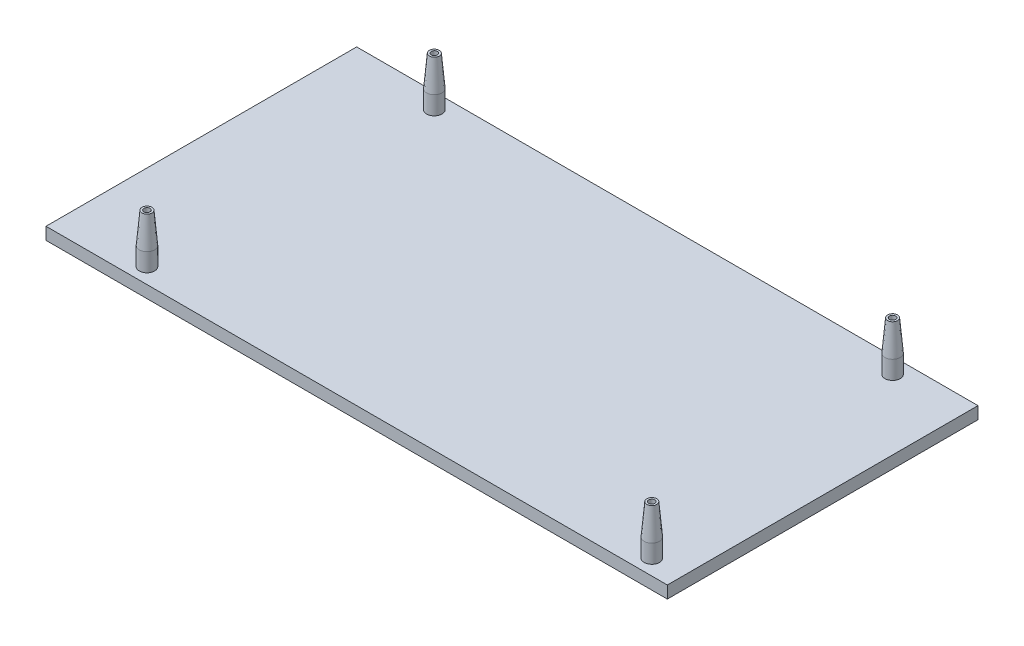
ISO-10303-21;
HEADER;
FILE_DESCRIPTION(('STEP AP214'),'2;1');
FILE_NAME('part.step','',(''),(''),'','','');
FILE_SCHEMA(('AUTOMOTIVE_DESIGN { 1 0 10303 214 1 1 1 1 }'));
ENDSEC;
DATA;
#1=APPLICATION_CONTEXT('core data for automotive mechanical design processes');
#2=APPLICATION_PROTOCOL_DEFINITION('international standard','automotive_design',2000,#1);
#3=PRODUCT_CONTEXT('',#1,'mechanical');
#4=PRODUCT('Part','Part','',(#3));
#5=PRODUCT_RELATED_PRODUCT_CATEGORY('part','',(#4));
#6=PRODUCT_DEFINITION_FORMATION('','',#4);
#7=PRODUCT_DEFINITION_CONTEXT('part definition',#1,'design');
#8=PRODUCT_DEFINITION('design','',#6,#7);
#9=PRODUCT_DEFINITION_SHAPE('','',#8);
#10=(LENGTH_UNIT() NAMED_UNIT(*) SI_UNIT(.MILLI.,.METRE.));
#11=(NAMED_UNIT(*) PLANE_ANGLE_UNIT() SI_UNIT($,.RADIAN.));
#12=(NAMED_UNIT(*) SI_UNIT($,.STERADIAN.) SOLID_ANGLE_UNIT());
#13=UNCERTAINTY_MEASURE_WITH_UNIT(LENGTH_MEASURE(1.E-05),#10,'distance_accuracy_value','');
#14=(GEOMETRIC_REPRESENTATION_CONTEXT(3) GLOBAL_UNCERTAINTY_ASSIGNED_CONTEXT((#13)) GLOBAL_UNIT_ASSIGNED_CONTEXT((#10,
#11,#12)) REPRESENTATION_CONTEXT('',''));
#15=CARTESIAN_POINT('',(0.,0.,0.));
#16=DIRECTION('',(0.,0.,1.));
#17=DIRECTION('',(1.,0.,0.));
#18=AXIS2_PLACEMENT_3D('',#15,#16,#17);
#19=CARTESIAN_POINT('',(0.,2.,0.));
#20=DIRECTION('',(0.,1.,0.));
#21=DIRECTION('',(0.,0.,1.));
#22=AXIS2_PLACEMENT_3D('',#19,#20,#21);
#23=PLANE('',#22);
#24=CARTESIAN_POINT('',(70.1588451313209,2.,24.0196720833392));
#25=DIRECTION('',(0.,1.,0.));
#26=DIRECTION('',(0.,0.,1.));
#27=AXIS2_PLACEMENT_3D('',#24,#25,#26);
#28=CIRCLE('',#27,1.25);
#29=CARTESIAN_POINT('',(70.1588451313209,2.,25.2696720833392));
#30=VERTEX_POINT('',#29);
#31=EDGE_CURVE('E199',#30,#30,#28,.T.);
#32=ORIENTED_EDGE('',*,*,#31,.F.);
#33=EDGE_LOOP('',(#32));
#34=FACE_BOUND('',#33,.T.);
#35=CARTESIAN_POINT('',(-11.1211548686791,2.,-21.7003279166608));
#36=DIRECTION('',(0.,1.,0.));
#37=DIRECTION('',(0.,0.,1.));
#38=AXIS2_PLACEMENT_3D('',#35,#36,#37);
#39=CIRCLE('',#38,1.25);
#40=CARTESIAN_POINT('',(-11.1211548686791,2.,-20.4503279166608));
#41=VERTEX_POINT('',#40);
#42=EDGE_CURVE('E211',#41,#41,#39,.T.);
#43=ORIENTED_EDGE('',*,*,#42,.F.);
#44=EDGE_LOOP('',(#43));
#45=FACE_BOUND('',#44,.T.);
#46=DIRECTION('',(0.,0.,1.));
#47=VECTOR('',#46,1.);
#48=CARTESIAN_POINT('',(-26.3611548686791,2.,-24.2403279166608));
#49=LINE('',#48,#47);
#50=CARTESIAN_POINT('',(-26.3611548686791,2.,-24.2403279166608));
#51=VERTEX_POINT('',#50);
#52=CARTESIAN_POINT('',(-26.3611548686791,2.,26.5596720833392));
#53=VERTEX_POINT('',#52);
#54=EDGE_CURVE('E86',#51,#53,#49,.T.);
#55=ORIENTED_EDGE('',*,*,#54,.T.);
#56=DIRECTION('',(1.,0.,0.));
#57=VECTOR('',#56,1.);
#58=CARTESIAN_POINT('',(-26.3611548686791,2.,26.5596720833392));
#59=LINE('',#58,#57);
#60=CARTESIAN_POINT('',(75.2388451313209,2.,26.5596720833392));
#61=VERTEX_POINT('',#60);
#62=EDGE_CURVE('E81',#53,#61,#59,.T.);
#63=ORIENTED_EDGE('',*,*,#62,.T.);
#64=DIRECTION('',(0.,0.,-1.));
#65=VECTOR('',#64,1.);
#66=CARTESIAN_POINT('',(75.2388451313209,2.,-24.2403279166608));
#67=LINE('',#66,#65);
#68=CARTESIAN_POINT('',(75.2388451313209,2.,-24.2403279166608));
#69=VERTEX_POINT('',#68);
#70=EDGE_CURVE('E84',#61,#69,#67,.T.);
#71=ORIENTED_EDGE('',*,*,#70,.T.);
#72=DIRECTION('',(-1.,0.,0.));
#73=VECTOR('',#72,1.);
#74=CARTESIAN_POINT('',(-26.3611548686791,2.,-24.2403279166608));
#75=LINE('',#74,#73);
#76=EDGE_CURVE('E50',#69,#51,#75,.T.);
#77=ORIENTED_EDGE('',*,*,#76,.T.);
#78=EDGE_LOOP('',(#55,#63,#71,#77));
#79=FACE_BOUND('',#78,.T.);
#80=CARTESIAN_POINT('',(-12.3911548686791,2.,24.0196720833392));
#81=DIRECTION('',(0.,1.,0.));
#82=DIRECTION('',(0.,0.,1.));
#83=AXIS2_PLACEMENT_3D('',#80,#81,#82);
#84=CIRCLE('',#83,1.25);
#85=CARTESIAN_POINT('',(-12.3911548686791,2.,25.2696720833392));
#86=VERTEX_POINT('',#85);
#87=EDGE_CURVE('E205',#86,#86,#84,.T.);
#88=ORIENTED_EDGE('',*,*,#87,.F.);
#89=EDGE_LOOP('',(#88));
#90=FACE_BOUND('',#89,.T.);
#91=CARTESIAN_POINT('',(63.8088451313209,2.,-21.7003279166608));
#92=DIRECTION('',(0.,1.,0.));
#93=DIRECTION('',(0.,0.,1.));
#94=AXIS2_PLACEMENT_3D('',#91,#92,#93);
#95=CIRCLE('',#94,1.25);
#96=CARTESIAN_POINT('',(63.8088451313209,2.,-20.4503279166608));
#97=VERTEX_POINT('',#96);
#98=EDGE_CURVE('E191',#97,#97,#95,.T.);
#99=ORIENTED_EDGE('',*,*,#98,.F.);
#100=EDGE_LOOP('',(#99));
#101=FACE_BOUND('',#100,.T.);
#102=ADVANCED_FACE('F33',(#34,#45,#79,#90,#101),#23,.T.);
#103=CARTESIAN_POINT('',(0.,0.,0.));
#104=DIRECTION('',(0.,1.,0.));
#105=DIRECTION('',(0.,0.,1.));
#106=AXIS2_PLACEMENT_3D('',#103,#104,#105);
#107=PLANE('',#106);
#108=DIRECTION('',(0.,0.,1.));
#109=VECTOR('',#108,1.);
#110=CARTESIAN_POINT('',(-26.3611548686791,0.,-24.2403279166608));
#111=LINE('',#110,#109);
#112=CARTESIAN_POINT('',(-26.3611548686791,0.,-24.2403279166608));
#113=VERTEX_POINT('',#112);
#114=CARTESIAN_POINT('',(-26.3611548686791,0.,26.5596720833392));
#115=VERTEX_POINT('',#114);
#116=EDGE_CURVE('E101',#113,#115,#111,.T.);
#117=ORIENTED_EDGE('',*,*,#116,.F.);
#118=DIRECTION('',(-1.,0.,0.));
#119=VECTOR('',#118,1.);
#120=CARTESIAN_POINT('',(-26.3611548686791,0.,-24.2403279166608));
#121=LINE('',#120,#119);
#122=CARTESIAN_POINT('',(75.2388451313209,0.,-24.2403279166608));
#123=VERTEX_POINT('',#122);
#124=EDGE_CURVE('E73',#123,#113,#121,.T.);
#125=ORIENTED_EDGE('',*,*,#124,.F.);
#126=DIRECTION('',(0.,0.,-1.));
#127=VECTOR('',#126,1.);
#128=CARTESIAN_POINT('',(75.2388451313209,0.,-24.2403279166608));
#129=LINE('',#128,#127);
#130=CARTESIAN_POINT('',(75.2388451313209,0.,26.5596720833392));
#131=VERTEX_POINT('',#130);
#132=EDGE_CURVE('E67',#131,#123,#129,.T.);
#133=ORIENTED_EDGE('',*,*,#132,.F.);
#134=DIRECTION('',(1.,0.,0.));
#135=VECTOR('',#134,1.);
#136=CARTESIAN_POINT('',(-26.3611548686791,0.,26.5596720833392));
#137=LINE('',#136,#135);
#138=EDGE_CURVE('E91',#115,#131,#137,.T.);
#139=ORIENTED_EDGE('',*,*,#138,.F.);
#140=EDGE_LOOP('',(#117,#125,#133,#139));
#141=FACE_BOUND('',#140,.T.);
#142=CARTESIAN_POINT('',(-11.1211548686791,0.,-21.7003279166608));
#143=DIRECTION('',(0.,1.,0.));
#144=DIRECTION('',(0.,0.,1.));
#145=AXIS2_PLACEMENT_3D('',#142,#143,#144);
#146=CIRCLE('',#145,0.500000000000001);
#147=CARTESIAN_POINT('',(-11.1211548686791,0.,-21.2003279166608));
#148=VERTEX_POINT('',#147);
#149=EDGE_CURVE('E104',#148,#148,#146,.T.);
#150=ORIENTED_EDGE('',*,*,#149,.T.);
#151=EDGE_LOOP('',(#150));
#152=FACE_BOUND('',#151,.T.);
#153=CARTESIAN_POINT('',(-12.3911548686791,0.,24.0196720833392));
#154=DIRECTION('',(0.,1.,0.));
#155=DIRECTION('',(0.,0.,1.));
#156=AXIS2_PLACEMENT_3D('',#153,#154,#155);
#157=CIRCLE('',#156,0.500000000000001);
#158=CARTESIAN_POINT('',(-12.3911548686791,0.,24.5196720833392));
#159=VERTEX_POINT('',#158);
#160=EDGE_CURVE('E220',#159,#159,#157,.T.);
#161=ORIENTED_EDGE('',*,*,#160,.T.);
#162=EDGE_LOOP('',(#161));
#163=FACE_BOUND('',#162,.T.);
#164=CARTESIAN_POINT('',(63.8088451313209,0.,-21.7003279166608));
#165=DIRECTION('',(0.,1.,0.));
#166=DIRECTION('',(0.,0.,1.));
#167=AXIS2_PLACEMENT_3D('',#164,#165,#166);
#168=CIRCLE('',#167,0.499999999999999);
#169=CARTESIAN_POINT('',(63.8088451313209,0.,-21.2003279166608));
#170=VERTEX_POINT('',#169);
#171=EDGE_CURVE('E217',#170,#170,#168,.T.);
#172=ORIENTED_EDGE('',*,*,#171,.T.);
#173=EDGE_LOOP('',(#172));
#174=FACE_BOUND('',#173,.T.);
#175=CARTESIAN_POINT('',(70.1588451313209,0.,24.0196720833392));
#176=DIRECTION('',(0.,1.,0.));
#177=DIRECTION('',(0.,0.,1.));
#178=AXIS2_PLACEMENT_3D('',#175,#176,#177);
#179=CIRCLE('',#178,0.499999999999999);
#180=CARTESIAN_POINT('',(70.1588451313209,0.,24.5196720833392));
#181=VERTEX_POINT('',#180);
#182=EDGE_CURVE('E214',#181,#181,#179,.T.);
#183=ORIENTED_EDGE('',*,*,#182,.T.);
#184=EDGE_LOOP('',(#183));
#185=FACE_BOUND('',#184,.T.);
#186=ADVANCED_FACE('F144',(#141,#152,#163,#174,#185),#107,.F.);
#187=CARTESIAN_POINT('',(-26.3611548686791,2.,-24.2403279166608));
#188=DIRECTION('',(1.,0.,0.));
#189=DIRECTION('',(0.,0.,-1.));
#190=AXIS2_PLACEMENT_3D('',#187,#188,#189);
#191=PLANE('',#190);
#192=ORIENTED_EDGE('',*,*,#116,.T.);
#193=DIRECTION('',(0.,-1.,0.));
#194=VECTOR('',#193,1.);
#195=CARTESIAN_POINT('',(-26.3611548686791,2.,26.5596720833392));
#196=LINE('',#195,#194);
#197=EDGE_CURVE('E92',#53,#115,#196,.T.);
#198=ORIENTED_EDGE('',*,*,#197,.F.);
#199=ORIENTED_EDGE('',*,*,#54,.F.);
#200=DIRECTION('',(0.,-1.,0.));
#201=VECTOR('',#200,1.);
#202=CARTESIAN_POINT('',(-26.3611548686791,2.,-24.2403279166608));
#203=LINE('',#202,#201);
#204=EDGE_CURVE('E97',#51,#113,#203,.T.);
#205=ORIENTED_EDGE('',*,*,#204,.T.);
#206=EDGE_LOOP('',(#192,#198,#199,#205));
#207=FACE_BOUND('',#206,.T.);
#208=ADVANCED_FACE('F150',(#207),#191,.F.);
#209=CARTESIAN_POINT('',(-26.3611548686791,2.,26.5596720833392));
#210=DIRECTION('',(0.,0.,-1.));
#211=DIRECTION('',(-1.,0.,0.));
#212=AXIS2_PLACEMENT_3D('',#209,#210,#211);
#213=PLANE('',#212);
#214=ORIENTED_EDGE('',*,*,#138,.T.);
#215=DIRECTION('',(0.,-1.,0.));
#216=VECTOR('',#215,1.);
#217=CARTESIAN_POINT('',(75.2388451313209,2.,26.5596720833392));
#218=LINE('',#217,#216);
#219=EDGE_CURVE('E89',#61,#131,#218,.T.);
#220=ORIENTED_EDGE('',*,*,#219,.F.);
#221=ORIENTED_EDGE('',*,*,#62,.F.);
#222=ORIENTED_EDGE('',*,*,#197,.T.);
#223=EDGE_LOOP('',(#214,#220,#221,#222));
#224=FACE_BOUND('',#223,.T.);
#225=ADVANCED_FACE('F90',(#224),#213,.F.);
#226=CARTESIAN_POINT('',(75.2388451313209,2.,-24.2403279166608));
#227=DIRECTION('',(-1.,0.,0.));
#228=DIRECTION('',(0.,0.,1.));
#229=AXIS2_PLACEMENT_3D('',#226,#227,#228);
#230=PLANE('',#229);
#231=ORIENTED_EDGE('',*,*,#132,.T.);
#232=DIRECTION('',(0.,-1.,0.));
#233=VECTOR('',#232,1.);
#234=CARTESIAN_POINT('',(75.2388451313209,2.,-24.2403279166608));
#235=LINE('',#234,#233);
#236=EDGE_CURVE('E93',#69,#123,#235,.T.);
#237=ORIENTED_EDGE('',*,*,#236,.F.);
#238=ORIENTED_EDGE('',*,*,#70,.F.);
#239=ORIENTED_EDGE('',*,*,#219,.T.);
#240=EDGE_LOOP('',(#231,#237,#238,#239));
#241=FACE_BOUND('',#240,.T.);
#242=ADVANCED_FACE('F95',(#241),#230,.F.);
#243=CARTESIAN_POINT('',(-26.3611548686791,2.,-24.2403279166608));
#244=DIRECTION('',(0.,0.,1.));
#245=DIRECTION('',(1.,0.,0.));
#246=AXIS2_PLACEMENT_3D('',#243,#244,#245);
#247=PLANE('',#246);
#248=ORIENTED_EDGE('',*,*,#124,.T.);
#249=ORIENTED_EDGE('',*,*,#204,.F.);
#250=ORIENTED_EDGE('',*,*,#76,.F.);
#251=ORIENTED_EDGE('',*,*,#236,.T.);
#252=EDGE_LOOP('',(#248,#249,#250,#251));
#253=FACE_BOUND('',#252,.T.);
#254=ADVANCED_FACE('F159',(#253),#247,.F.);
#255=CARTESIAN_POINT('',(-11.1211548686791,2.,-21.7003279166608));
#256=DIRECTION('',(0.,-1.,0.));
#257=DIRECTION('',(0.,0.,-1.));
#258=AXIS2_PLACEMENT_3D('',#255,#256,#257);
#259=CYLINDRICAL_SURFACE('',#258,0.500000000000001);
#260=ORIENTED_EDGE('',*,*,#149,.F.);
#261=EDGE_LOOP('',(#260));
#262=FACE_BOUND('',#261,.T.);
#263=CARTESIAN_POINT('',(-11.1211548686791,10.,-21.7003279166608));
#264=DIRECTION('',(0.,1.,0.));
#265=DIRECTION('',(0.,0.,1.));
#266=AXIS2_PLACEMENT_3D('',#263,#264,#265);
#267=CIRCLE('',#266,0.500000000000001);
#268=CARTESIAN_POINT('',(-11.1211548686791,10.,-21.2003279166608));
#269=VERTEX_POINT('',#268);
#270=EDGE_CURVE('E208',#269,#269,#267,.T.);
#271=ORIENTED_EDGE('',*,*,#270,.T.);
#272=EDGE_LOOP('',(#271));
#273=FACE_BOUND('',#272,.T.);
#274=ADVANCED_FACE('F156',(#262,#273),#259,.F.);
#275=CARTESIAN_POINT('',(-12.3911548686791,2.,24.0196720833392));
#276=DIRECTION('',(0.,-1.,0.));
#277=DIRECTION('',(0.,0.,-1.));
#278=AXIS2_PLACEMENT_3D('',#275,#276,#277);
#279=CYLINDRICAL_SURFACE('',#278,0.500000000000001);
#280=ORIENTED_EDGE('',*,*,#160,.F.);
#281=EDGE_LOOP('',(#280));
#282=FACE_BOUND('',#281,.T.);
#283=CARTESIAN_POINT('',(-12.3911548686791,10.,24.0196720833392));
#284=DIRECTION('',(0.,1.,0.));
#285=DIRECTION('',(0.,0.,1.));
#286=AXIS2_PLACEMENT_3D('',#283,#284,#285);
#287=CIRCLE('',#286,0.500000000000001);
#288=CARTESIAN_POINT('',(-12.3911548686791,10.,24.5196720833392));
#289=VERTEX_POINT('',#288);
#290=EDGE_CURVE('E202',#289,#289,#287,.T.);
#291=ORIENTED_EDGE('',*,*,#290,.T.);
#292=EDGE_LOOP('',(#291));
#293=FACE_BOUND('',#292,.T.);
#294=ADVANCED_FACE('F230',(#282,#293),#279,.F.);
#295=CARTESIAN_POINT('',(63.8088451313209,2.,-21.7003279166608));
#296=DIRECTION('',(0.,-1.,0.));
#297=DIRECTION('',(0.,0.,-1.));
#298=AXIS2_PLACEMENT_3D('',#295,#296,#297);
#299=CYLINDRICAL_SURFACE('',#298,0.499999999999999);
#300=ORIENTED_EDGE('',*,*,#171,.F.);
#301=EDGE_LOOP('',(#300));
#302=FACE_BOUND('',#301,.T.);
#303=CARTESIAN_POINT('',(63.8088451313209,10.,-21.7003279166608));
#304=DIRECTION('',(0.,1.,0.));
#305=DIRECTION('',(0.,0.,1.));
#306=AXIS2_PLACEMENT_3D('',#303,#304,#305);
#307=CIRCLE('',#306,0.499999999999999);
#308=CARTESIAN_POINT('',(63.8088451313209,10.,-21.2003279166608));
#309=VERTEX_POINT('',#308);
#310=EDGE_CURVE('E189',#309,#309,#307,.T.);
#311=ORIENTED_EDGE('',*,*,#310,.T.);
#312=EDGE_LOOP('',(#311));
#313=FACE_BOUND('',#312,.T.);
#314=ADVANCED_FACE('F245',(#302,#313),#299,.F.);
#315=CARTESIAN_POINT('',(70.1588451313209,2.,24.0196720833392));
#316=DIRECTION('',(0.,-1.,0.));
#317=DIRECTION('',(0.,0.,-1.));
#318=AXIS2_PLACEMENT_3D('',#315,#316,#317);
#319=CYLINDRICAL_SURFACE('',#318,0.499999999999999);
#320=ORIENTED_EDGE('',*,*,#182,.F.);
#321=EDGE_LOOP('',(#320));
#322=FACE_BOUND('',#321,.T.);
#323=CARTESIAN_POINT('',(70.1588451313209,10.,24.0196720833392));
#324=DIRECTION('',(0.,1.,0.));
#325=DIRECTION('',(0.,0.,1.));
#326=AXIS2_PLACEMENT_3D('',#323,#324,#325);
#327=CIRCLE('',#326,0.499999999999999);
#328=CARTESIAN_POINT('',(70.1588451313209,10.,24.5196720833392));
#329=VERTEX_POINT('',#328);
#330=EDGE_CURVE('E194',#329,#329,#327,.T.);
#331=ORIENTED_EDGE('',*,*,#330,.T.);
#332=EDGE_LOOP('',(#331));
#333=FACE_BOUND('',#332,.T.);
#334=ADVANCED_FACE('F236',(#322,#333),#319,.F.);
#335=CARTESIAN_POINT('',(-11.1211548686791,10.,-21.7003279166608));
#336=DIRECTION('',(0.,1.,0.));
#337=DIRECTION('',(0.,0.,1.));
#338=AXIS2_PLACEMENT_3D('',#335,#336,#337);
#339=PLANE('',#338);
#340=CARTESIAN_POINT('',(-11.1211548686791,10.,-21.7003279166608));
#341=DIRECTION('',(0.,1.,0.));
#342=DIRECTION('',(0.,0.,1.));
#343=AXIS2_PLACEMENT_3D('',#340,#341,#342);
#344=CIRCLE('',#343,0.812556682370437);
#345=CARTESIAN_POINT('',(-11.1211548686791,10.,-20.8877712342904));
#346=VERTEX_POINT('',#345);
#347=EDGE_CURVE('E111',#346,#346,#344,.T.);
#348=ORIENTED_EDGE('',*,*,#347,.T.);
#349=EDGE_LOOP('',(#348));
#350=FACE_BOUND('',#349,.T.);
#351=ORIENTED_EDGE('',*,*,#270,.F.);
#352=EDGE_LOOP('',(#351));
#353=FACE_BOUND('',#352,.T.);
#354=ADVANCED_FACE('F233',(#350,#353),#339,.T.);
#355=CARTESIAN_POINT('',(-11.1211548686791,10.,-21.7003279166608));
#356=DIRECTION('',(0.,-1.,0.));
#357=DIRECTION('',(0.,0.,-1.));
#358=AXIS2_PLACEMENT_3D('',#355,#356,#357);
#359=CYLINDRICAL_SURFACE('',#358,1.25);
#360=CARTESIAN_POINT('',(-11.1211548686791,5.00000000000053,-21.7003279166608));
#361=DIRECTION('',(0.,1.,0.));
#362=DIRECTION('',(0.,0.,1.));
#363=AXIS2_PLACEMENT_3D('',#360,#361,#362);
#364=CIRCLE('',#363,1.25);
#365=CARTESIAN_POINT('',(-11.1211548686791,5.00000000000053,-20.4503279166608));
#366=VERTEX_POINT('',#365);
#367=EDGE_CURVE('E114',#366,#366,#364,.F.);
#368=ORIENTED_EDGE('',*,*,#367,.T.);
#369=EDGE_LOOP('',(#368));
#370=FACE_BOUND('',#369,.T.);
#371=ORIENTED_EDGE('',*,*,#42,.T.);
#372=EDGE_LOOP('',(#371));
#373=FACE_BOUND('',#372,.T.);
#374=ADVANCED_FACE('F235',(#370,#373),#359,.T.);
#375=CARTESIAN_POINT('',(-12.3911548686791,10.,24.0196720833392));
#376=DIRECTION('',(0.,1.,0.));
#377=DIRECTION('',(0.,0.,1.));
#378=AXIS2_PLACEMENT_3D('',#375,#376,#377);
#379=PLANE('',#378);
#380=CARTESIAN_POINT('',(-12.3911548686791,10.,24.0196720833392));
#381=DIRECTION('',(0.,1.,0.));
#382=DIRECTION('',(0.,0.,1.));
#383=AXIS2_PLACEMENT_3D('',#380,#381,#382);
#384=CIRCLE('',#383,0.812556682370437);
#385=CARTESIAN_POINT('',(-12.3911548686791,10.,24.8322287657096));
#386=VERTEX_POINT('',#385);
#387=EDGE_CURVE('E42',#386,#386,#384,.T.);
#388=ORIENTED_EDGE('',*,*,#387,.T.);
#389=EDGE_LOOP('',(#388));
#390=FACE_BOUND('',#389,.T.);
#391=ORIENTED_EDGE('',*,*,#290,.F.);
#392=EDGE_LOOP('',(#391));
#393=FACE_BOUND('',#392,.T.);
#394=ADVANCED_FACE('F131',(#390,#393),#379,.T.);
#395=CARTESIAN_POINT('',(-12.3911548686791,10.,24.0196720833392));
#396=DIRECTION('',(0.,-1.,0.));
#397=DIRECTION('',(0.,0.,-1.));
#398=AXIS2_PLACEMENT_3D('',#395,#396,#397);
#399=CYLINDRICAL_SURFACE('',#398,1.25);
#400=CARTESIAN_POINT('',(-12.3911548686791,5.00000000000053,24.0196720833392));
#401=DIRECTION('',(0.,1.,0.));
#402=DIRECTION('',(0.,0.,1.));
#403=AXIS2_PLACEMENT_3D('',#400,#401,#402);
#404=CIRCLE('',#403,1.25);
#405=CARTESIAN_POINT('',(-12.3911548686791,5.00000000000053,25.2696720833392));
#406=VERTEX_POINT('',#405);
#407=EDGE_CURVE('E11',#406,#406,#404,.F.);
#408=ORIENTED_EDGE('',*,*,#407,.T.);
#409=EDGE_LOOP('',(#408));
#410=FACE_BOUND('',#409,.T.);
#411=ORIENTED_EDGE('',*,*,#87,.T.);
#412=EDGE_LOOP('',(#411));
#413=FACE_BOUND('',#412,.T.);
#414=ADVANCED_FACE('F249',(#410,#413),#399,.T.);
#415=CARTESIAN_POINT('',(70.1588451313209,10.,24.0196720833392));
#416=DIRECTION('',(0.,1.,0.));
#417=DIRECTION('',(0.,0.,1.));
#418=AXIS2_PLACEMENT_3D('',#415,#416,#417);
#419=PLANE('',#418);
#420=CARTESIAN_POINT('',(70.1588451313209,10.,24.0196720833392));
#421=DIRECTION('',(0.,1.,0.));
#422=DIRECTION('',(0.,0.,1.));
#423=AXIS2_PLACEMENT_3D('',#420,#421,#422);
#424=CIRCLE('',#423,0.812556682370437);
#425=CARTESIAN_POINT('',(70.1588451313209,10.,24.8322287657096));
#426=VERTEX_POINT('',#425);
#427=EDGE_CURVE('E123',#426,#426,#424,.T.);
#428=ORIENTED_EDGE('',*,*,#427,.T.);
#429=EDGE_LOOP('',(#428));
#430=FACE_BOUND('',#429,.T.);
#431=ORIENTED_EDGE('',*,*,#330,.F.);
#432=EDGE_LOOP('',(#431));
#433=FACE_BOUND('',#432,.T.);
#434=ADVANCED_FACE('F265',(#430,#433),#419,.T.);
#435=CARTESIAN_POINT('',(70.1588451313209,10.,24.0196720833392));
#436=DIRECTION('',(0.,-1.,0.));
#437=DIRECTION('',(0.,0.,-1.));
#438=AXIS2_PLACEMENT_3D('',#435,#436,#437);
#439=CYLINDRICAL_SURFACE('',#438,1.25);
#440=CARTESIAN_POINT('',(70.1588451313209,5.00000000000055,24.0196720833392));
#441=DIRECTION('',(0.,1.,0.));
#442=DIRECTION('',(0.,0.,1.));
#443=AXIS2_PLACEMENT_3D('',#440,#441,#442);
#444=CIRCLE('',#443,1.25);
#445=CARTESIAN_POINT('',(70.1588451313209,5.00000000000055,25.2696720833392));
#446=VERTEX_POINT('',#445);
#447=EDGE_CURVE('E126',#446,#446,#444,.F.);
#448=ORIENTED_EDGE('',*,*,#447,.T.);
#449=EDGE_LOOP('',(#448));
#450=FACE_BOUND('',#449,.T.);
#451=ORIENTED_EDGE('',*,*,#31,.T.);
#452=EDGE_LOOP('',(#451));
#453=FACE_BOUND('',#452,.T.);
#454=ADVANCED_FACE('F185',(#450,#453),#439,.T.);
#455=CARTESIAN_POINT('',(63.8088451313209,10.,-21.7003279166608));
#456=DIRECTION('',(0.,1.,0.));
#457=DIRECTION('',(0.,0.,1.));
#458=AXIS2_PLACEMENT_3D('',#455,#456,#457);
#459=PLANE('',#458);
#460=CARTESIAN_POINT('',(63.8088451313209,10.,-21.7003279166608));
#461=DIRECTION('',(0.,1.,0.));
#462=DIRECTION('',(0.,0.,1.));
#463=AXIS2_PLACEMENT_3D('',#460,#461,#462);
#464=CIRCLE('',#463,0.812556682370437);
#465=CARTESIAN_POINT('',(63.8088451313209,10.,-20.8877712342904));
#466=VERTEX_POINT('',#465);
#467=EDGE_CURVE('E117',#466,#466,#464,.T.);
#468=ORIENTED_EDGE('',*,*,#467,.T.);
#469=EDGE_LOOP('',(#468));
#470=FACE_BOUND('',#469,.T.);
#471=ORIENTED_EDGE('',*,*,#310,.F.);
#472=EDGE_LOOP('',(#471));
#473=FACE_BOUND('',#472,.T.);
#474=ADVANCED_FACE('F182',(#470,#473),#459,.T.);
#475=CARTESIAN_POINT('',(63.8088451313209,10.,-21.7003279166608));
#476=DIRECTION('',(0.,-1.,0.));
#477=DIRECTION('',(0.,0.,-1.));
#478=AXIS2_PLACEMENT_3D('',#475,#476,#477);
#479=CYLINDRICAL_SURFACE('',#478,1.25);
#480=CARTESIAN_POINT('',(63.8088451313209,5.00000000000055,-21.7003279166608));
#481=DIRECTION('',(0.,1.,0.));
#482=DIRECTION('',(0.,0.,1.));
#483=AXIS2_PLACEMENT_3D('',#480,#481,#482);
#484=CIRCLE('',#483,1.25);
#485=CARTESIAN_POINT('',(63.8088451313209,5.00000000000055,-20.4503279166608));
#486=VERTEX_POINT('',#485);
#487=EDGE_CURVE('E120',#486,#486,#484,.F.);
#488=ORIENTED_EDGE('',*,*,#487,.T.);
#489=EDGE_LOOP('',(#488));
#490=FACE_BOUND('',#489,.T.);
#491=ORIENTED_EDGE('',*,*,#98,.T.);
#492=EDGE_LOOP('',(#491));
#493=FACE_BOUND('',#492,.T.);
#494=ADVANCED_FACE('F172',(#490,#493),#479,.T.);
#495=CARTESIAN_POINT('',(-11.1211548686791,10.,-21.7003279166608));
#496=DIRECTION('',(0.,-1.,0.));
#497=DIRECTION('',(0.,0.,-1.));
#498=AXIS2_PLACEMENT_3D('',#495,#496,#497);
#499=CONICAL_SURFACE('',#498,0.812556682370437,0.0872664625997143);
#500=ORIENTED_EDGE('',*,*,#367,.F.);
#501=EDGE_LOOP('',(#500));
#502=FACE_BOUND('',#501,.T.);
#503=ORIENTED_EDGE('',*,*,#347,.F.);
#504=EDGE_LOOP('',(#503));
#505=FACE_BOUND('',#504,.T.);
#506=ADVANCED_FACE('F169',(#502,#505),#499,.T.);
#507=CARTESIAN_POINT('',(63.8088451313209,10.,-21.7003279166608));
#508=DIRECTION('',(0.,-1.,0.));
#509=DIRECTION('',(0.,0.,-1.));
#510=AXIS2_PLACEMENT_3D('',#507,#508,#509);
#511=CONICAL_SURFACE('',#510,0.812556682370437,0.0872664625997143);
#512=ORIENTED_EDGE('',*,*,#487,.F.);
#513=EDGE_LOOP('',(#512));
#514=FACE_BOUND('',#513,.T.);
#515=ORIENTED_EDGE('',*,*,#467,.F.);
#516=EDGE_LOOP('',(#515));
#517=FACE_BOUND('',#516,.T.);
#518=ADVANCED_FACE('F140',(#514,#517),#511,.T.);
#519=CARTESIAN_POINT('',(70.1588451313209,10.,24.0196720833392));
#520=DIRECTION('',(0.,-1.,0.));
#521=DIRECTION('',(0.,0.,-1.));
#522=AXIS2_PLACEMENT_3D('',#519,#520,#521);
#523=CONICAL_SURFACE('',#522,0.812556682370437,0.0872664625997143);
#524=ORIENTED_EDGE('',*,*,#447,.F.);
#525=EDGE_LOOP('',(#524));
#526=FACE_BOUND('',#525,.T.);
#527=ORIENTED_EDGE('',*,*,#427,.F.);
#528=EDGE_LOOP('',(#527));
#529=FACE_BOUND('',#528,.T.);
#530=ADVANCED_FACE('F135',(#526,#529),#523,.T.);
#531=CARTESIAN_POINT('',(-12.3911548686791,10.,24.0196720833392));
#532=DIRECTION('',(0.,-1.,0.));
#533=DIRECTION('',(0.,0.,-1.));
#534=AXIS2_PLACEMENT_3D('',#531,#532,#533);
#535=CONICAL_SURFACE('',#534,0.812556682370437,0.0872664625997143);
#536=ORIENTED_EDGE('',*,*,#407,.F.);
#537=EDGE_LOOP('',(#536));
#538=FACE_BOUND('',#537,.T.);
#539=ORIENTED_EDGE('',*,*,#387,.F.);
#540=EDGE_LOOP('',(#539));
#541=FACE_BOUND('',#540,.T.);
#542=ADVANCED_FACE('F35',(#538,#541),#535,.T.);
#543=CLOSED_SHELL('',(#102,#186,#208,#225,#242,#254,#274,#294,#314,#334,#354,#374,#394,#414,
#434,#454,#474,#494,#506,#518,#530,#542));
#544=MANIFOLD_SOLID_BREP('B2',#543);
#545=ADVANCED_BREP_SHAPE_REPRESENTATION('',(#18,#544),#14);
#546=SHAPE_DEFINITION_REPRESENTATION(#9,#545);
ENDSEC;
END-ISO-10303-21;
